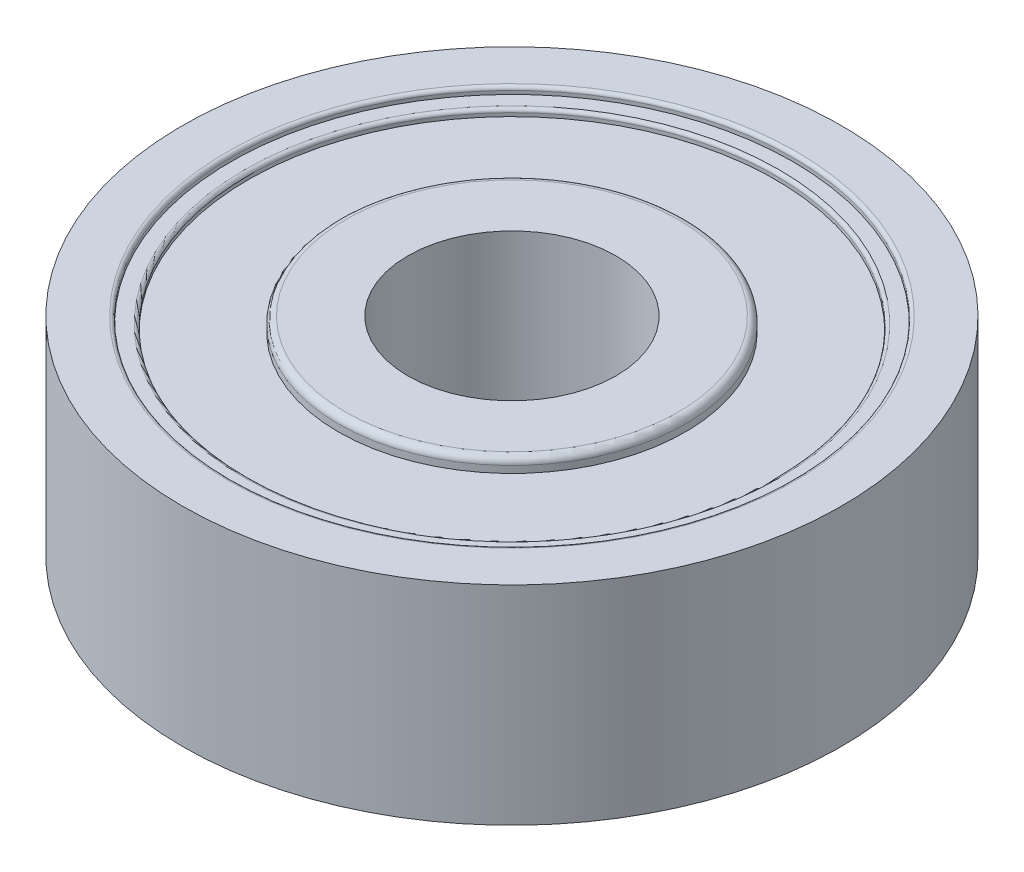
ISO-10303-21;
HEADER;
FILE_DESCRIPTION(('STEP AP214'),'2;1');
FILE_NAME('part.step','',(''),(''),'','','');
FILE_SCHEMA(('AUTOMOTIVE_DESIGN { 1 0 10303 214 1 1 1 1 }'));
ENDSEC;
DATA;
#1=APPLICATION_CONTEXT('core data for automotive mechanical design processes');
#2=APPLICATION_PROTOCOL_DEFINITION('international standard','automotive_design',2000,#1);
#3=PRODUCT_CONTEXT('',#1,'mechanical');
#4=PRODUCT('Part','Part','',(#3));
#5=PRODUCT_RELATED_PRODUCT_CATEGORY('part','',(#4));
#6=PRODUCT_DEFINITION_FORMATION('','',#4);
#7=PRODUCT_DEFINITION_CONTEXT('part definition',#1,'design');
#8=PRODUCT_DEFINITION('design','',#6,#7);
#9=PRODUCT_DEFINITION_SHAPE('','',#8);
#10=(LENGTH_UNIT() NAMED_UNIT(*) SI_UNIT(.MILLI.,.METRE.));
#11=(NAMED_UNIT(*) PLANE_ANGLE_UNIT() SI_UNIT($,.RADIAN.));
#12=(NAMED_UNIT(*) SI_UNIT($,.STERADIAN.) SOLID_ANGLE_UNIT());
#13=UNCERTAINTY_MEASURE_WITH_UNIT(LENGTH_MEASURE(1.E-05),#10,'distance_accuracy_value','');
#14=(GEOMETRIC_REPRESENTATION_CONTEXT(3) GLOBAL_UNCERTAINTY_ASSIGNED_CONTEXT((#13)) GLOBAL_UNIT_ASSIGNED_CONTEXT((#10,
#11,#12)) REPRESENTATION_CONTEXT('',''));
#15=CARTESIAN_POINT('',(0.,0.,0.));
#16=DIRECTION('',(0.,0.,1.));
#17=DIRECTION('',(1.,0.,0.));
#18=AXIS2_PLACEMENT_3D('',#15,#16,#17);
#19=CARTESIAN_POINT('',(0.,6.,0.));
#20=DIRECTION('',(0.,1.,0.));
#21=DIRECTION('',(0.,0.,1.));
#22=AXIS2_PLACEMENT_3D('',#19,#20,#21);
#23=PLANE('',#22);
#24=CARTESIAN_POINT('',(0.,6.,0.));
#25=DIRECTION('',(0.,1.,0.));
#26=DIRECTION('',(0.,0.,1.));
#27=AXIS2_PLACEMENT_3D('',#24,#25,#26);
#28=CIRCLE('',#27,4.8);
#29=CARTESIAN_POINT('',(0.,6.,4.8));
#30=VERTEX_POINT('',#29);
#31=EDGE_CURVE('E56',#30,#30,#28,.T.);
#32=ORIENTED_EDGE('',*,*,#31,.T.);
#33=EDGE_LOOP('',(#32));
#34=FACE_BOUND('',#33,.T.);
#35=CARTESIAN_POINT('',(0.,6.,0.));
#36=DIRECTION('',(0.,1.,0.));
#37=DIRECTION('',(0.,0.,1.));
#38=AXIS2_PLACEMENT_3D('',#35,#36,#37);
#39=CIRCLE('',#38,3.);
#40=CARTESIAN_POINT('',(0.,6.,3.));
#41=VERTEX_POINT('',#40);
#42=EDGE_CURVE('E62',#41,#41,#39,.T.);
#43=ORIENTED_EDGE('',*,*,#42,.F.);
#44=EDGE_LOOP('',(#43));
#45=FACE_BOUND('',#44,.T.);
#46=ADVANCED_FACE('F33',(#34,#45),#23,.T.);
#47=CARTESIAN_POINT('',(0.,6.,0.));
#48=DIRECTION('',(0.,-1.,0.));
#49=DIRECTION('',(0.,0.,-1.));
#50=AXIS2_PLACEMENT_3D('',#47,#48,#49);
#51=CYLINDRICAL_SURFACE('',#50,9.5);
#52=CARTESIAN_POINT('',(0.,6.,0.));
#53=DIRECTION('',(0.,1.,0.));
#54=DIRECTION('',(0.,0.,1.));
#55=AXIS2_PLACEMENT_3D('',#52,#53,#54);
#56=CIRCLE('',#55,9.5);
#57=CARTESIAN_POINT('',(0.,6.,9.5));
#58=VERTEX_POINT('',#57);
#59=EDGE_CURVE('E59',#58,#58,#56,.T.);
#60=ORIENTED_EDGE('',*,*,#59,.F.);
#61=EDGE_LOOP('',(#60));
#62=FACE_BOUND('',#61,.T.);
#63=CARTESIAN_POINT('',(0.,0.,0.));
#64=DIRECTION('',(0.,1.,0.));
#65=DIRECTION('',(0.,0.,1.));
#66=AXIS2_PLACEMENT_3D('',#63,#64,#65);
#67=CIRCLE('',#66,9.5);
#68=CARTESIAN_POINT('',(0.,0.,9.5));
#69=VERTEX_POINT('',#68);
#70=EDGE_CURVE('E92',#69,#69,#67,.T.);
#71=ORIENTED_EDGE('',*,*,#70,.T.);
#72=EDGE_LOOP('',(#71));
#73=FACE_BOUND('',#72,.T.);
#74=ADVANCED_FACE('F127',(#62,#73),#51,.T.);
#75=CARTESIAN_POINT('',(0.,6.,0.));
#76=DIRECTION('',(0.,1.,0.));
#77=DIRECTION('',(0.,0.,1.));
#78=AXIS2_PLACEMENT_3D('',#75,#76,#77);
#79=CIRCLE('',#78,8.2);
#80=CARTESIAN_POINT('',(0.,6.,8.2));
#81=VERTEX_POINT('',#80);
#82=EDGE_CURVE('E44',#81,#81,#79,.F.);
#83=ORIENTED_EDGE('',*,*,#82,.T.);
#84=EDGE_LOOP('',(#83));
#85=FACE_BOUND('',#84,.T.);
#86=ORIENTED_EDGE('',*,*,#59,.T.);
#87=EDGE_LOOP('',(#86));
#88=FACE_BOUND('',#87,.T.);
#89=ADVANCED_FACE('F130',(#85,#88),#23,.T.);
#90=CARTESIAN_POINT('',(0.,0.,0.));
#91=DIRECTION('',(0.,1.,0.));
#92=DIRECTION('',(0.,0.,1.));
#93=AXIS2_PLACEMENT_3D('',#90,#91,#92);
#94=CYLINDRICAL_SURFACE('',#93,3.);
#95=ORIENTED_EDGE('',*,*,#42,.T.);
#96=EDGE_LOOP('',(#95));
#97=FACE_BOUND('',#96,.T.);
#98=CARTESIAN_POINT('',(0.,0.,0.));
#99=DIRECTION('',(0.,1.,0.));
#100=DIRECTION('',(0.,0.,1.));
#101=AXIS2_PLACEMENT_3D('',#98,#99,#100);
#102=CIRCLE('',#101,3.);
#103=CARTESIAN_POINT('',(0.,0.,3.));
#104=VERTEX_POINT('',#103);
#105=EDGE_CURVE('E95',#104,#104,#102,.T.);
#106=ORIENTED_EDGE('',*,*,#105,.F.);
#107=EDGE_LOOP('',(#106));
#108=FACE_BOUND('',#107,.T.);
#109=ADVANCED_FACE('F139',(#97,#108),#94,.F.);
#110=CARTESIAN_POINT('',(0.,5.8,0.));
#111=DIRECTION('',(0.,1.,0.));
#112=DIRECTION('',(0.,0.,1.));
#113=AXIS2_PLACEMENT_3D('',#110,#111,#112);
#114=CYLINDRICAL_SURFACE('',#113,8.1);
#115=CARTESIAN_POINT('',(0.,5.9,0.));
#116=DIRECTION('',(0.,1.,0.));
#117=DIRECTION('',(0.,0.,1.));
#118=AXIS2_PLACEMENT_3D('',#115,#116,#117);
#119=CIRCLE('',#118,8.1);
#120=CARTESIAN_POINT('',(0.,5.9,8.1));
#121=VERTEX_POINT('',#120);
#122=EDGE_CURVE('E48',#121,#121,#119,.T.);
#123=ORIENTED_EDGE('',*,*,#122,.T.);
#124=EDGE_LOOP('',(#123));
#125=FACE_BOUND('',#124,.T.);
#126=CARTESIAN_POINT('',(0.,5.8,0.));
#127=DIRECTION('',(0.,1.,0.));
#128=DIRECTION('',(0.,0.,1.));
#129=AXIS2_PLACEMENT_3D('',#126,#127,#128);
#130=CIRCLE('',#129,8.1);
#131=CARTESIAN_POINT('',(0.,5.8,8.1));
#132=VERTEX_POINT('',#131);
#133=EDGE_CURVE('E65',#132,#132,#130,.T.);
#134=ORIENTED_EDGE('',*,*,#133,.F.);
#135=EDGE_LOOP('',(#134));
#136=FACE_BOUND('',#135,.T.);
#137=ADVANCED_FACE('F144',(#125,#136),#114,.F.);
#138=CARTESIAN_POINT('',(0.,5.8,0.));
#139=DIRECTION('',(0.,1.,0.));
#140=DIRECTION('',(0.,0.,1.));
#141=AXIS2_PLACEMENT_3D('',#138,#139,#140);
#142=PLANE('',#141);
#143=CARTESIAN_POINT('',(0.,5.8,0.));
#144=DIRECTION('',(0.,1.,0.));
#145=DIRECTION('',(0.,0.,1.));
#146=AXIS2_PLACEMENT_3D('',#143,#144,#145);
#147=CIRCLE('',#146,7.7);
#148=CARTESIAN_POINT('',(0.,5.8,7.7));
#149=VERTEX_POINT('',#148);
#150=EDGE_CURVE('E10',#149,#149,#147,.F.);
#151=ORIENTED_EDGE('',*,*,#150,.T.);
#152=EDGE_LOOP('',(#151));
#153=FACE_BOUND('',#152,.T.);
#154=ORIENTED_EDGE('',*,*,#133,.T.);
#155=EDGE_LOOP('',(#154));
#156=FACE_BOUND('',#155,.T.);
#157=ADVANCED_FACE('F188',(#153,#156),#142,.T.);
#158=CARTESIAN_POINT('',(0.,5.6,0.));
#159=DIRECTION('',(0.,1.,0.));
#160=DIRECTION('',(0.,0.,1.));
#161=AXIS2_PLACEMENT_3D('',#158,#159,#160);
#162=CYLINDRICAL_SURFACE('',#161,7.6);
#163=CARTESIAN_POINT('',(0.,5.7,0.));
#164=DIRECTION('',(0.,1.,0.));
#165=DIRECTION('',(0.,0.,1.));
#166=AXIS2_PLACEMENT_3D('',#163,#164,#165);
#167=CIRCLE('',#166,7.6);
#168=CARTESIAN_POINT('',(0.,5.7,7.6));
#169=VERTEX_POINT('',#168);
#170=EDGE_CURVE('E40',#169,#169,#167,.T.);
#171=ORIENTED_EDGE('',*,*,#170,.T.);
#172=EDGE_LOOP('',(#171));
#173=FACE_BOUND('',#172,.T.);
#174=CARTESIAN_POINT('',(0.,5.6,0.));
#175=DIRECTION('',(0.,1.,0.));
#176=DIRECTION('',(0.,0.,1.));
#177=AXIS2_PLACEMENT_3D('',#174,#175,#176);
#178=CIRCLE('',#177,7.6);
#179=CARTESIAN_POINT('',(0.,5.6,7.6));
#180=VERTEX_POINT('',#179);
#181=EDGE_CURVE('E68',#180,#180,#178,.T.);
#182=ORIENTED_EDGE('',*,*,#181,.F.);
#183=EDGE_LOOP('',(#182));
#184=FACE_BOUND('',#183,.T.);
#185=ADVANCED_FACE('F184',(#173,#184),#162,.F.);
#186=CARTESIAN_POINT('',(0.,5.6,0.));
#187=DIRECTION('',(0.,1.,0.));
#188=DIRECTION('',(0.,0.,1.));
#189=AXIS2_PLACEMENT_3D('',#186,#187,#188);
#190=PLANE('',#189);
#191=CARTESIAN_POINT('',(0.,5.6,0.));
#192=DIRECTION('',(0.,1.,0.));
#193=DIRECTION('',(0.,0.,1.));
#194=AXIS2_PLACEMENT_3D('',#191,#192,#193);
#195=CIRCLE('',#194,5.);
#196=CARTESIAN_POINT('',(0.,5.6,5.));
#197=VERTEX_POINT('',#196);
#198=EDGE_CURVE('E71',#197,#197,#195,.T.);
#199=ORIENTED_EDGE('',*,*,#198,.F.);
#200=EDGE_LOOP('',(#199));
#201=FACE_BOUND('',#200,.T.);
#202=ORIENTED_EDGE('',*,*,#181,.T.);
#203=EDGE_LOOP('',(#202));
#204=FACE_BOUND('',#203,.T.);
#205=ADVANCED_FACE('F180',(#201,#204),#190,.T.);
#206=CARTESIAN_POINT('',(0.,5.6,0.));
#207=DIRECTION('',(0.,1.,0.));
#208=DIRECTION('',(0.,0.,1.));
#209=AXIS2_PLACEMENT_3D('',#206,#207,#208);
#210=CYLINDRICAL_SURFACE('',#209,5.);
#211=CARTESIAN_POINT('',(0.,5.8,0.));
#212=DIRECTION('',(0.,1.,0.));
#213=DIRECTION('',(0.,0.,1.));
#214=AXIS2_PLACEMENT_3D('',#211,#212,#213);
#215=CIRCLE('',#214,5.);
#216=CARTESIAN_POINT('',(0.,5.8,5.));
#217=VERTEX_POINT('',#216);
#218=EDGE_CURVE('E53',#217,#217,#215,.F.);
#219=ORIENTED_EDGE('',*,*,#218,.T.);
#220=EDGE_LOOP('',(#219));
#221=FACE_BOUND('',#220,.T.);
#222=ORIENTED_EDGE('',*,*,#198,.T.);
#223=EDGE_LOOP('',(#222));
#224=FACE_BOUND('',#223,.T.);
#225=ADVANCED_FACE('F176',(#221,#224),#210,.T.);
#226=CARTESIAN_POINT('',(0.,5.8,0.));
#227=DIRECTION('',(0.,1.,0.));
#228=DIRECTION('',(0.,0.,1.));
#229=AXIS2_PLACEMENT_3D('',#226,#227,#228);
#230=TOROIDAL_SURFACE('',#229,4.8,0.2);
#231=ORIENTED_EDGE('',*,*,#218,.F.);
#232=EDGE_LOOP('',(#231));
#233=FACE_BOUND('',#232,.T.);
#234=ORIENTED_EDGE('',*,*,#31,.F.);
#235=EDGE_LOOP('',(#234));
#236=FACE_BOUND('',#235,.T.);
#237=ADVANCED_FACE('F179',(#233,#236),#230,.T.);
#238=CARTESIAN_POINT('',(0.,5.9,0.));
#239=DIRECTION('',(0.,1.,0.));
#240=DIRECTION('',(0.,0.,1.));
#241=AXIS2_PLACEMENT_3D('',#238,#239,#240);
#242=TOROIDAL_SURFACE('',#241,8.2,0.1);
#243=ORIENTED_EDGE('',*,*,#82,.F.);
#244=EDGE_LOOP('',(#243));
#245=FACE_BOUND('',#244,.T.);
#246=ORIENTED_EDGE('',*,*,#122,.F.);
#247=EDGE_LOOP('',(#246));
#248=FACE_BOUND('',#247,.T.);
#249=ADVANCED_FACE('F200',(#245,#248),#242,.T.);
#250=CARTESIAN_POINT('',(0.,5.7,0.));
#251=DIRECTION('',(0.,1.,0.));
#252=DIRECTION('',(0.,0.,1.));
#253=AXIS2_PLACEMENT_3D('',#250,#251,#252);
#254=TOROIDAL_SURFACE('',#253,7.7,0.1);
#255=ORIENTED_EDGE('',*,*,#150,.F.);
#256=EDGE_LOOP('',(#255));
#257=FACE_BOUND('',#256,.T.);
#258=ORIENTED_EDGE('',*,*,#170,.F.);
#259=EDGE_LOOP('',(#258));
#260=FACE_BOUND('',#259,.T.);
#261=ADVANCED_FACE('F35',(#257,#260),#254,.T.);
#262=CARTESIAN_POINT('',(0.,0.,0.));
#263=DIRECTION('',(0.,-1.,0.));
#264=DIRECTION('',(0.,0.,1.));
#265=AXIS2_PLACEMENT_3D('',#262,#263,#264);
#266=PLANE('',#265);
#267=CARTESIAN_POINT('',(0.,0.,0.));
#268=DIRECTION('',(0.,1.,0.));
#269=DIRECTION('',(0.,0.,1.));
#270=AXIS2_PLACEMENT_3D('',#267,#268,#269);
#271=CIRCLE('',#270,4.8);
#272=CARTESIAN_POINT('',(0.,0.,4.8));
#273=VERTEX_POINT('',#272);
#274=EDGE_CURVE('E89',#273,#273,#271,.T.);
#275=ORIENTED_EDGE('',*,*,#274,.F.);
#276=EDGE_LOOP('',(#275));
#277=FACE_BOUND('',#276,.T.);
#278=ORIENTED_EDGE('',*,*,#105,.T.);
#279=EDGE_LOOP('',(#278));
#280=FACE_BOUND('',#279,.T.);
#281=ADVANCED_FACE('F155',(#277,#280),#266,.T.);
#282=CARTESIAN_POINT('',(0.,0.,0.));
#283=DIRECTION('',(0.,1.,0.));
#284=DIRECTION('',(0.,0.,1.));
#285=AXIS2_PLACEMENT_3D('',#282,#283,#284);
#286=CIRCLE('',#285,8.2);
#287=CARTESIAN_POINT('',(0.,0.,8.2));
#288=VERTEX_POINT('',#287);
#289=EDGE_CURVE('E80',#288,#288,#286,.F.);
#290=ORIENTED_EDGE('',*,*,#289,.F.);
#291=EDGE_LOOP('',(#290));
#292=FACE_BOUND('',#291,.T.);
#293=ORIENTED_EDGE('',*,*,#70,.F.);
#294=EDGE_LOOP('',(#293));
#295=FACE_BOUND('',#294,.T.);
#296=ADVANCED_FACE('F152',(#292,#295),#266,.T.);
#297=CARTESIAN_POINT('',(0.,0.2,0.));
#298=DIRECTION('',(0.,-1.,0.));
#299=DIRECTION('',(0.,0.,1.));
#300=AXIS2_PLACEMENT_3D('',#297,#298,#299);
#301=CYLINDRICAL_SURFACE('',#300,8.1);
#302=CARTESIAN_POINT('',(0.,0.1,0.));
#303=DIRECTION('',(0.,1.,0.));
#304=DIRECTION('',(0.,0.,1.));
#305=AXIS2_PLACEMENT_3D('',#302,#303,#304);
#306=CIRCLE('',#305,8.1);
#307=CARTESIAN_POINT('',(0.,0.1,8.1));
#308=VERTEX_POINT('',#307);
#309=EDGE_CURVE('E83',#308,#308,#306,.T.);
#310=ORIENTED_EDGE('',*,*,#309,.F.);
#311=EDGE_LOOP('',(#310));
#312=FACE_BOUND('',#311,.T.);
#313=CARTESIAN_POINT('',(0.,0.2,0.));
#314=DIRECTION('',(0.,1.,0.));
#315=DIRECTION('',(0.,0.,1.));
#316=AXIS2_PLACEMENT_3D('',#313,#314,#315);
#317=CIRCLE('',#316,8.1);
#318=CARTESIAN_POINT('',(0.,0.2,8.1));
#319=VERTEX_POINT('',#318);
#320=EDGE_CURVE('E98',#319,#319,#317,.T.);
#321=ORIENTED_EDGE('',*,*,#320,.T.);
#322=EDGE_LOOP('',(#321));
#323=FACE_BOUND('',#322,.T.);
#324=ADVANCED_FACE('F154',(#312,#323),#301,.F.);
#325=CARTESIAN_POINT('',(0.,0.2,0.));
#326=DIRECTION('',(0.,-1.,0.));
#327=DIRECTION('',(0.,0.,1.));
#328=AXIS2_PLACEMENT_3D('',#325,#326,#327);
#329=PLANE('',#328);
#330=CARTESIAN_POINT('',(0.,0.2,0.));
#331=DIRECTION('',(0.,1.,0.));
#332=DIRECTION('',(0.,0.,1.));
#333=AXIS2_PLACEMENT_3D('',#330,#331,#332);
#334=CIRCLE('',#333,7.7);
#335=CARTESIAN_POINT('',(0.,0.2,7.7));
#336=VERTEX_POINT('',#335);
#337=EDGE_CURVE('E74',#336,#336,#334,.F.);
#338=ORIENTED_EDGE('',*,*,#337,.F.);
#339=EDGE_LOOP('',(#338));
#340=FACE_BOUND('',#339,.T.);
#341=ORIENTED_EDGE('',*,*,#320,.F.);
#342=EDGE_LOOP('',(#341));
#343=FACE_BOUND('',#342,.T.);
#344=ADVANCED_FACE('F162',(#340,#343),#329,.T.);
#345=CARTESIAN_POINT('',(0.,0.4,0.));
#346=DIRECTION('',(0.,-1.,0.));
#347=DIRECTION('',(0.,0.,1.));
#348=AXIS2_PLACEMENT_3D('',#345,#346,#347);
#349=CYLINDRICAL_SURFACE('',#348,7.6);
#350=CARTESIAN_POINT('',(0.,0.3,0.));
#351=DIRECTION('',(0.,1.,0.));
#352=DIRECTION('',(0.,0.,1.));
#353=AXIS2_PLACEMENT_3D('',#350,#351,#352);
#354=CIRCLE('',#353,7.6);
#355=CARTESIAN_POINT('',(0.,0.3,7.6));
#356=VERTEX_POINT('',#355);
#357=EDGE_CURVE('E77',#356,#356,#354,.T.);
#358=ORIENTED_EDGE('',*,*,#357,.F.);
#359=EDGE_LOOP('',(#358));
#360=FACE_BOUND('',#359,.T.);
#361=CARTESIAN_POINT('',(0.,0.4,0.));
#362=DIRECTION('',(0.,1.,0.));
#363=DIRECTION('',(0.,0.,1.));
#364=AXIS2_PLACEMENT_3D('',#361,#362,#363);
#365=CIRCLE('',#364,7.6);
#366=CARTESIAN_POINT('',(0.,0.4,7.6));
#367=VERTEX_POINT('',#366);
#368=EDGE_CURVE('E101',#367,#367,#365,.T.);
#369=ORIENTED_EDGE('',*,*,#368,.T.);
#370=EDGE_LOOP('',(#369));
#371=FACE_BOUND('',#370,.T.);
#372=ADVANCED_FACE('F123',(#360,#371),#349,.F.);
#373=CARTESIAN_POINT('',(0.,0.4,0.));
#374=DIRECTION('',(0.,-1.,0.));
#375=DIRECTION('',(0.,0.,1.));
#376=AXIS2_PLACEMENT_3D('',#373,#374,#375);
#377=PLANE('',#376);
#378=CARTESIAN_POINT('',(0.,0.4,0.));
#379=DIRECTION('',(0.,1.,0.));
#380=DIRECTION('',(0.,0.,1.));
#381=AXIS2_PLACEMENT_3D('',#378,#379,#380);
#382=CIRCLE('',#381,5.);
#383=CARTESIAN_POINT('',(0.,0.4,5.));
#384=VERTEX_POINT('',#383);
#385=EDGE_CURVE('E104',#384,#384,#382,.T.);
#386=ORIENTED_EDGE('',*,*,#385,.T.);
#387=EDGE_LOOP('',(#386));
#388=FACE_BOUND('',#387,.T.);
#389=ORIENTED_EDGE('',*,*,#368,.F.);
#390=EDGE_LOOP('',(#389));
#391=FACE_BOUND('',#390,.T.);
#392=ADVANCED_FACE('F108',(#388,#391),#377,.T.);
#393=CARTESIAN_POINT('',(0.,0.4,0.));
#394=DIRECTION('',(0.,-1.,0.));
#395=DIRECTION('',(0.,0.,1.));
#396=AXIS2_PLACEMENT_3D('',#393,#394,#395);
#397=CYLINDRICAL_SURFACE('',#396,5.);
#398=CARTESIAN_POINT('',(0.,0.2,0.));
#399=DIRECTION('',(0.,1.,0.));
#400=DIRECTION('',(0.,0.,1.));
#401=AXIS2_PLACEMENT_3D('',#398,#399,#400);
#402=CIRCLE('',#401,5.);
#403=CARTESIAN_POINT('',(0.,0.2,5.));
#404=VERTEX_POINT('',#403);
#405=EDGE_CURVE('E86',#404,#404,#402,.F.);
#406=ORIENTED_EDGE('',*,*,#405,.F.);
#407=EDGE_LOOP('',(#406));
#408=FACE_BOUND('',#407,.T.);
#409=ORIENTED_EDGE('',*,*,#385,.F.);
#410=EDGE_LOOP('',(#409));
#411=FACE_BOUND('',#410,.T.);
#412=ADVANCED_FACE('F111',(#408,#411),#397,.T.);
#413=CARTESIAN_POINT('',(0.,0.2,0.));
#414=DIRECTION('',(0.,-1.,0.));
#415=DIRECTION('',(0.,0.,1.));
#416=AXIS2_PLACEMENT_3D('',#413,#414,#415);
#417=TOROIDAL_SURFACE('',#416,4.8,0.2);
#418=ORIENTED_EDGE('',*,*,#405,.T.);
#419=EDGE_LOOP('',(#418));
#420=FACE_BOUND('',#419,.T.);
#421=ORIENTED_EDGE('',*,*,#274,.T.);
#422=EDGE_LOOP('',(#421));
#423=FACE_BOUND('',#422,.T.);
#424=ADVANCED_FACE('F113',(#420,#423),#417,.T.);
#425=CARTESIAN_POINT('',(0.,0.1,0.));
#426=DIRECTION('',(0.,-1.,0.));
#427=DIRECTION('',(0.,0.,1.));
#428=AXIS2_PLACEMENT_3D('',#425,#426,#427);
#429=TOROIDAL_SURFACE('',#428,8.2,0.1);
#430=ORIENTED_EDGE('',*,*,#289,.T.);
#431=EDGE_LOOP('',(#430));
#432=FACE_BOUND('',#431,.T.);
#433=ORIENTED_EDGE('',*,*,#309,.T.);
#434=EDGE_LOOP('',(#433));
#435=FACE_BOUND('',#434,.T.);
#436=ADVANCED_FACE('F120',(#432,#435),#429,.T.);
#437=CARTESIAN_POINT('',(0.,0.3,0.));
#438=DIRECTION('',(0.,-1.,0.));
#439=DIRECTION('',(0.,0.,1.));
#440=AXIS2_PLACEMENT_3D('',#437,#438,#439);
#441=TOROIDAL_SURFACE('',#440,7.7,0.1);
#442=ORIENTED_EDGE('',*,*,#337,.T.);
#443=EDGE_LOOP('',(#442));
#444=FACE_BOUND('',#443,.T.);
#445=ORIENTED_EDGE('',*,*,#357,.T.);
#446=EDGE_LOOP('',(#445));
#447=FACE_BOUND('',#446,.T.);
#448=ADVANCED_FACE('F171',(#444,#447),#441,.T.);
#449=CLOSED_SHELL('',(#46,#74,#89,#109,#137,#157,#185,#205,#225,#237,#249,#261,#281,#296,#324,
#344,#372,#392,#412,#424,#436,#448));
#450=MANIFOLD_SOLID_BREP('B2',#449);
#451=ADVANCED_BREP_SHAPE_REPRESENTATION('',(#18,#450),#14);
#452=SHAPE_DEFINITION_REPRESENTATION(#9,#451);
ENDSEC;
END-ISO-10303-21;
